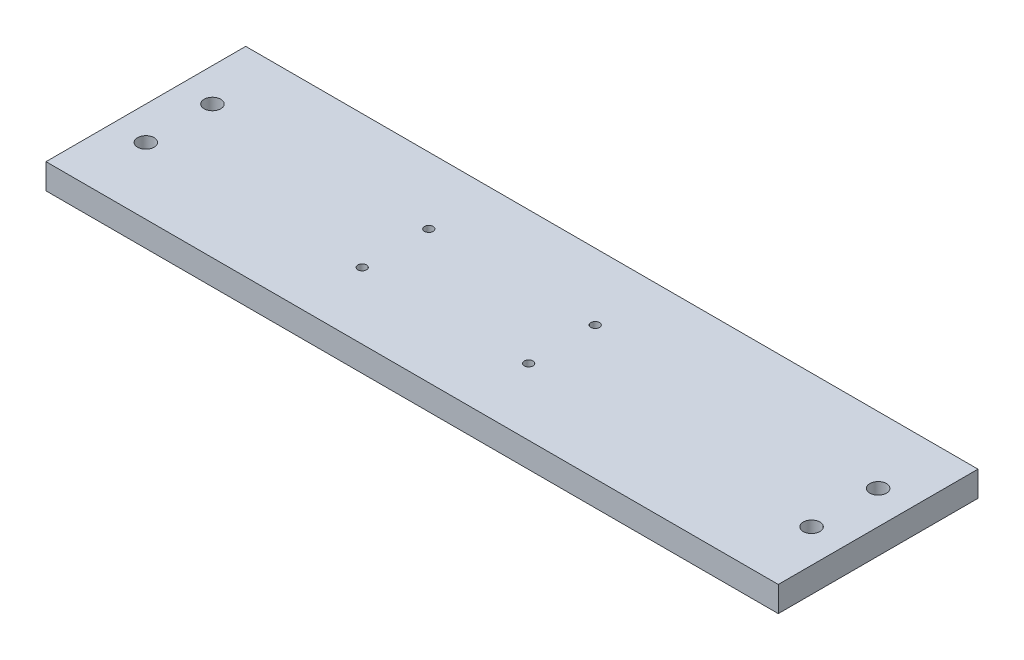
ISO-10303-21;
HEADER;
FILE_DESCRIPTION(('STEP AP214'),'2;1');
FILE_NAME('part.step','',(''),(''),'','','');
FILE_SCHEMA(('AUTOMOTIVE_DESIGN { 1 0 10303 214 1 1 1 1 }'));
ENDSEC;
DATA;
#1=APPLICATION_CONTEXT('core data for automotive mechanical design processes');
#2=APPLICATION_PROTOCOL_DEFINITION('international standard','automotive_design',2000,#1);
#3=PRODUCT_CONTEXT('',#1,'mechanical');
#4=PRODUCT('Part','Part','',(#3));
#5=PRODUCT_RELATED_PRODUCT_CATEGORY('part','',(#4));
#6=PRODUCT_DEFINITION_FORMATION('','',#4);
#7=PRODUCT_DEFINITION_CONTEXT('part definition',#1,'design');
#8=PRODUCT_DEFINITION('design','',#6,#7);
#9=PRODUCT_DEFINITION_SHAPE('','',#8);
#10=(LENGTH_UNIT() NAMED_UNIT(*) SI_UNIT(.MILLI.,.METRE.));
#11=(NAMED_UNIT(*) PLANE_ANGLE_UNIT() SI_UNIT($,.RADIAN.));
#12=(NAMED_UNIT(*) SI_UNIT($,.STERADIAN.) SOLID_ANGLE_UNIT());
#13=UNCERTAINTY_MEASURE_WITH_UNIT(LENGTH_MEASURE(1.E-05),#10,'distance_accuracy_value','');
#14=(GEOMETRIC_REPRESENTATION_CONTEXT(3) GLOBAL_UNCERTAINTY_ASSIGNED_CONTEXT((#13)) GLOBAL_UNIT_ASSIGNED_CONTEXT((#10,
#11,#12)) REPRESENTATION_CONTEXT('',''));
#15=CARTESIAN_POINT('',(0.,0.,0.));
#16=DIRECTION('',(0.,0.,1.));
#17=DIRECTION('',(1.,0.,0.));
#18=AXIS2_PLACEMENT_3D('',#15,#16,#17);
#19=CARTESIAN_POINT('',(139.7,9.652,-38.1));
#20=DIRECTION('',(-1.,0.,0.));
#21=DIRECTION('',(0.,0.,1.));
#22=AXIS2_PLACEMENT_3D('',#19,#20,#21);
#23=PLANE('',#22);
#24=DIRECTION('',(0.,0.,-1.));
#25=VECTOR('',#24,1.);
#26=CARTESIAN_POINT('',(139.7,0.,-38.1));
#27=LINE('',#26,#25);
#28=CARTESIAN_POINT('',(139.7,0.,38.1));
#29=VERTEX_POINT('',#28);
#30=CARTESIAN_POINT('',(139.7,0.,-38.1));
#31=VERTEX_POINT('',#30);
#32=EDGE_CURVE('E113',#29,#31,#27,.T.);
#33=ORIENTED_EDGE('',*,*,#32,.T.);
#34=DIRECTION('',(0.,-1.,0.));
#35=VECTOR('',#34,1.);
#36=CARTESIAN_POINT('',(139.7,9.652,-38.1));
#37=LINE('',#36,#35);
#38=CARTESIAN_POINT('',(139.7,9.652,-38.1));
#39=VERTEX_POINT('',#38);
#40=EDGE_CURVE('E11',#39,#31,#37,.T.);
#41=ORIENTED_EDGE('',*,*,#40,.F.);
#42=DIRECTION('',(0.,0.,-1.));
#43=VECTOR('',#42,1.);
#44=CARTESIAN_POINT('',(139.7,9.652,-38.1));
#45=LINE('',#44,#43);
#46=CARTESIAN_POINT('',(139.7,9.652,38.1));
#47=VERTEX_POINT('',#46);
#48=EDGE_CURVE('E97',#47,#39,#45,.T.);
#49=ORIENTED_EDGE('',*,*,#48,.F.);
#50=DIRECTION('',(0.,-1.,0.));
#51=VECTOR('',#50,1.);
#52=CARTESIAN_POINT('',(139.7,9.652,38.1));
#53=LINE('',#52,#51);
#54=EDGE_CURVE('E109',#47,#29,#53,.T.);
#55=ORIENTED_EDGE('',*,*,#54,.T.);
#56=EDGE_LOOP('',(#33,#41,#49,#55));
#57=FACE_BOUND('',#56,.T.);
#58=ADVANCED_FACE('F45',(#57),#23,.F.);
#59=CARTESIAN_POINT('',(-139.7,9.652,-38.1));
#60=DIRECTION('',(0.,0.,1.));
#61=DIRECTION('',(1.,0.,0.));
#62=AXIS2_PLACEMENT_3D('',#59,#60,#61);
#63=PLANE('',#62);
#64=DIRECTION('',(-1.,0.,0.));
#65=VECTOR('',#64,1.);
#66=CARTESIAN_POINT('',(-139.7,0.,-38.1));
#67=LINE('',#66,#65);
#68=CARTESIAN_POINT('',(-139.7,0.,-38.1));
#69=VERTEX_POINT('',#68);
#70=EDGE_CURVE('E102',#31,#69,#67,.T.);
#71=ORIENTED_EDGE('',*,*,#70,.T.);
#72=DIRECTION('',(0.,-1.,0.));
#73=VECTOR('',#72,1.);
#74=CARTESIAN_POINT('',(-139.7,9.652,-38.1));
#75=LINE('',#74,#73);
#76=CARTESIAN_POINT('',(-139.7,9.652,-38.1));
#77=VERTEX_POINT('',#76);
#78=EDGE_CURVE('E54',#77,#69,#75,.T.);
#79=ORIENTED_EDGE('',*,*,#78,.F.);
#80=DIRECTION('',(-1.,0.,0.));
#81=VECTOR('',#80,1.);
#82=CARTESIAN_POINT('',(-139.7,9.652,-38.1));
#83=LINE('',#82,#81);
#84=EDGE_CURVE('E92',#39,#77,#83,.T.);
#85=ORIENTED_EDGE('',*,*,#84,.F.);
#86=ORIENTED_EDGE('',*,*,#40,.T.);
#87=EDGE_LOOP('',(#71,#79,#85,#86));
#88=FACE_BOUND('',#87,.T.);
#89=ADVANCED_FACE('F101',(#88),#63,.F.);
#90=CARTESIAN_POINT('',(-139.7,9.652,-38.1));
#91=DIRECTION('',(1.,0.,0.));
#92=DIRECTION('',(0.,0.,-1.));
#93=AXIS2_PLACEMENT_3D('',#90,#91,#92);
#94=PLANE('',#93);
#95=DIRECTION('',(0.,0.,1.));
#96=VECTOR('',#95,1.);
#97=CARTESIAN_POINT('',(-139.7,0.,-38.1));
#98=LINE('',#97,#96);
#99=CARTESIAN_POINT('',(-139.7,0.,38.1));
#100=VERTEX_POINT('',#99);
#101=EDGE_CURVE('E79',#69,#100,#98,.T.);
#102=ORIENTED_EDGE('',*,*,#101,.T.);
#103=DIRECTION('',(0.,-1.,0.));
#104=VECTOR('',#103,1.);
#105=CARTESIAN_POINT('',(-139.7,9.652,38.1));
#106=LINE('',#105,#104);
#107=CARTESIAN_POINT('',(-139.7,9.652,38.1));
#108=VERTEX_POINT('',#107);
#109=EDGE_CURVE('E104',#108,#100,#106,.T.);
#110=ORIENTED_EDGE('',*,*,#109,.F.);
#111=DIRECTION('',(0.,0.,1.));
#112=VECTOR('',#111,1.);
#113=CARTESIAN_POINT('',(-139.7,9.652,-38.1));
#114=LINE('',#113,#112);
#115=EDGE_CURVE('E95',#77,#108,#114,.T.);
#116=ORIENTED_EDGE('',*,*,#115,.F.);
#117=ORIENTED_EDGE('',*,*,#78,.T.);
#118=EDGE_LOOP('',(#102,#110,#116,#117));
#119=FACE_BOUND('',#118,.T.);
#120=ADVANCED_FACE('F105',(#119),#94,.F.);
#121=CARTESIAN_POINT('',(-139.7,9.652,38.1));
#122=DIRECTION('',(0.,0.,-1.));
#123=DIRECTION('',(-1.,0.,0.));
#124=AXIS2_PLACEMENT_3D('',#121,#122,#123);
#125=PLANE('',#124);
#126=DIRECTION('',(1.,0.,0.));
#127=VECTOR('',#126,1.);
#128=CARTESIAN_POINT('',(-139.7,0.,38.1));
#129=LINE('',#128,#127);
#130=EDGE_CURVE('E85',#100,#29,#129,.T.);
#131=ORIENTED_EDGE('',*,*,#130,.T.);
#132=ORIENTED_EDGE('',*,*,#54,.F.);
#133=DIRECTION('',(1.,0.,0.));
#134=VECTOR('',#133,1.);
#135=CARTESIAN_POINT('',(-139.7,9.652,38.1));
#136=LINE('',#135,#134);
#137=EDGE_CURVE('E62',#108,#47,#136,.T.);
#138=ORIENTED_EDGE('',*,*,#137,.F.);
#139=ORIENTED_EDGE('',*,*,#109,.T.);
#140=EDGE_LOOP('',(#131,#132,#138,#139));
#141=FACE_BOUND('',#140,.T.);
#142=ADVANCED_FACE('F127',(#141),#125,.F.);
#143=CARTESIAN_POINT('',(0.,9.652,0.));
#144=DIRECTION('',(0.,1.,0.));
#145=DIRECTION('',(0.,0.,1.));
#146=AXIS2_PLACEMENT_3D('',#143,#144,#145);
#147=PLANE('',#146);
#148=CARTESIAN_POINT('',(-44.4500000000001,9.652,-12.7));
#149=DIRECTION('',(0.,1.,0.));
#150=DIRECTION('',(0.,0.,1.));
#151=AXIS2_PLACEMENT_3D('',#148,#149,#150);
#152=CIRCLE('',#151,1.651);
#153=CARTESIAN_POINT('',(-44.4500000000001,9.652,-11.049));
#154=VERTEX_POINT('',#153);
#155=EDGE_CURVE('E138',#154,#154,#152,.T.);
#156=ORIENTED_EDGE('',*,*,#155,.F.);
#157=EDGE_LOOP('',(#156));
#158=FACE_BOUND('',#157,.T.);
#159=CARTESIAN_POINT('',(19.0499999999999,9.652,-12.7));
#160=DIRECTION('',(0.,1.,0.));
#161=DIRECTION('',(0.,0.,1.));
#162=AXIS2_PLACEMENT_3D('',#159,#160,#161);
#163=CIRCLE('',#162,1.651);
#164=CARTESIAN_POINT('',(19.0499999999999,9.652,-11.049));
#165=VERTEX_POINT('',#164);
#166=EDGE_CURVE('E163',#165,#165,#163,.T.);
#167=ORIENTED_EDGE('',*,*,#166,.F.);
#168=EDGE_LOOP('',(#167));
#169=FACE_BOUND('',#168,.T.);
#170=CARTESIAN_POINT('',(127.,9.652,-12.7));
#171=DIRECTION('',(0.,1.,0.));
#172=DIRECTION('',(0.,0.,1.));
#173=AXIS2_PLACEMENT_3D('',#170,#171,#172);
#174=CIRCLE('',#173,3.175);
#175=CARTESIAN_POINT('',(127.,9.652,-9.525));
#176=VERTEX_POINT('',#175);
#177=EDGE_CURVE('E155',#176,#176,#174,.T.);
#178=ORIENTED_EDGE('',*,*,#177,.F.);
#179=EDGE_LOOP('',(#178));
#180=FACE_BOUND('',#179,.T.);
#181=CARTESIAN_POINT('',(127.,9.652,12.7));
#182=DIRECTION('',(0.,1.,0.));
#183=DIRECTION('',(0.,0.,-1.));
#184=AXIS2_PLACEMENT_3D('',#181,#182,#183);
#185=CIRCLE('',#184,3.175);
#186=CARTESIAN_POINT('',(127.,9.652,9.525));
#187=VERTEX_POINT('',#186);
#188=EDGE_CURVE('E146',#187,#187,#185,.T.);
#189=ORIENTED_EDGE('',*,*,#188,.F.);
#190=EDGE_LOOP('',(#189));
#191=FACE_BOUND('',#190,.T.);
#192=CARTESIAN_POINT('',(19.0499999999999,9.652,12.7));
#193=DIRECTION('',(0.,1.,0.));
#194=DIRECTION('',(0.,0.,-1.));
#195=AXIS2_PLACEMENT_3D('',#192,#193,#194);
#196=CIRCLE('',#195,1.651);
#197=CARTESIAN_POINT('',(19.0499999999999,9.652,11.049));
#198=VERTEX_POINT('',#197);
#199=EDGE_CURVE('E147',#198,#198,#196,.T.);
#200=ORIENTED_EDGE('',*,*,#199,.F.);
#201=EDGE_LOOP('',(#200));
#202=FACE_BOUND('',#201,.T.);
#203=CARTESIAN_POINT('',(-44.4500000000001,9.652,12.7));
#204=DIRECTION('',(0.,1.,0.));
#205=DIRECTION('',(0.,0.,-1.));
#206=AXIS2_PLACEMENT_3D('',#203,#204,#205);
#207=CIRCLE('',#206,1.651);
#208=CARTESIAN_POINT('',(-44.4500000000001,9.652,11.049));
#209=VERTEX_POINT('',#208);
#210=EDGE_CURVE('E186',#209,#209,#207,.T.);
#211=ORIENTED_EDGE('',*,*,#210,.F.);
#212=EDGE_LOOP('',(#211));
#213=FACE_BOUND('',#212,.T.);
#214=CARTESIAN_POINT('',(-127.,9.652,12.7));
#215=DIRECTION('',(0.,1.,0.));
#216=DIRECTION('',(0.,0.,-1.));
#217=AXIS2_PLACEMENT_3D('',#214,#215,#216);
#218=CIRCLE('',#217,3.175);
#219=CARTESIAN_POINT('',(-127.,9.652,9.525));
#220=VERTEX_POINT('',#219);
#221=EDGE_CURVE('E178',#220,#220,#218,.T.);
#222=ORIENTED_EDGE('',*,*,#221,.F.);
#223=EDGE_LOOP('',(#222));
#224=FACE_BOUND('',#223,.T.);
#225=CARTESIAN_POINT('',(-127.,9.652,-12.7));
#226=DIRECTION('',(0.,1.,0.));
#227=DIRECTION('',(0.,0.,1.));
#228=AXIS2_PLACEMENT_3D('',#225,#226,#227);
#229=CIRCLE('',#228,3.175);
#230=CARTESIAN_POINT('',(-127.,9.652,-9.525));
#231=VERTEX_POINT('',#230);
#232=EDGE_CURVE('E134',#231,#231,#229,.T.);
#233=ORIENTED_EDGE('',*,*,#232,.F.);
#234=EDGE_LOOP('',(#233));
#235=FACE_BOUND('',#234,.T.);
#236=ORIENTED_EDGE('',*,*,#48,.T.);
#237=ORIENTED_EDGE('',*,*,#84,.T.);
#238=ORIENTED_EDGE('',*,*,#115,.T.);
#239=ORIENTED_EDGE('',*,*,#137,.T.);
#240=EDGE_LOOP('',(#236,#237,#238,#239));
#241=FACE_BOUND('',#240,.T.);
#242=ADVANCED_FACE('F93',(#158,#169,#180,#191,#202,#213,#224,#235,#241),#147,.T.);
#243=CARTESIAN_POINT('',(0.,0.,0.));
#244=DIRECTION('',(0.,1.,0.));
#245=DIRECTION('',(0.,0.,1.));
#246=AXIS2_PLACEMENT_3D('',#243,#244,#245);
#247=PLANE('',#246);
#248=CARTESIAN_POINT('',(-44.4500000000001,0.,-12.7));
#249=DIRECTION('',(0.,1.,0.));
#250=DIRECTION('',(0.,0.,1.));
#251=AXIS2_PLACEMENT_3D('',#248,#249,#250);
#252=CIRCLE('',#251,1.651);
#253=CARTESIAN_POINT('',(-44.4500000000001,0.,-11.049));
#254=VERTEX_POINT('',#253);
#255=EDGE_CURVE('E167',#254,#254,#252,.T.);
#256=ORIENTED_EDGE('',*,*,#255,.T.);
#257=EDGE_LOOP('',(#256));
#258=FACE_BOUND('',#257,.T.);
#259=CARTESIAN_POINT('',(19.0499999999999,0.,-12.7));
#260=DIRECTION('',(0.,1.,0.));
#261=DIRECTION('',(0.,0.,1.));
#262=AXIS2_PLACEMENT_3D('',#259,#260,#261);
#263=CIRCLE('',#262,1.651);
#264=CARTESIAN_POINT('',(19.0499999999999,0.,-11.049));
#265=VERTEX_POINT('',#264);
#266=EDGE_CURVE('E159',#265,#265,#263,.T.);
#267=ORIENTED_EDGE('',*,*,#266,.T.);
#268=EDGE_LOOP('',(#267));
#269=FACE_BOUND('',#268,.T.);
#270=CARTESIAN_POINT('',(127.,0.,-12.7));
#271=DIRECTION('',(0.,1.,0.));
#272=DIRECTION('',(0.,0.,1.));
#273=AXIS2_PLACEMENT_3D('',#270,#271,#272);
#274=CIRCLE('',#273,3.175);
#275=CARTESIAN_POINT('',(127.,0.,-9.525));
#276=VERTEX_POINT('',#275);
#277=EDGE_CURVE('E151',#276,#276,#274,.T.);
#278=ORIENTED_EDGE('',*,*,#277,.T.);
#279=EDGE_LOOP('',(#278));
#280=FACE_BOUND('',#279,.T.);
#281=CARTESIAN_POINT('',(127.,0.,12.7));
#282=DIRECTION('',(0.,1.,0.));
#283=DIRECTION('',(0.,0.,-1.));
#284=AXIS2_PLACEMENT_3D('',#281,#282,#283);
#285=CIRCLE('',#284,3.175);
#286=CARTESIAN_POINT('',(127.,0.,9.525));
#287=VERTEX_POINT('',#286);
#288=EDGE_CURVE('E142',#287,#287,#285,.T.);
#289=ORIENTED_EDGE('',*,*,#288,.T.);
#290=EDGE_LOOP('',(#289));
#291=FACE_BOUND('',#290,.T.);
#292=CARTESIAN_POINT('',(19.0499999999999,0.,12.7));
#293=DIRECTION('',(0.,1.,0.));
#294=DIRECTION('',(0.,0.,-1.));
#295=AXIS2_PLACEMENT_3D('',#292,#293,#294);
#296=CIRCLE('',#295,1.651);
#297=CARTESIAN_POINT('',(19.0499999999999,0.,11.049));
#298=VERTEX_POINT('',#297);
#299=EDGE_CURVE('E190',#298,#298,#296,.T.);
#300=ORIENTED_EDGE('',*,*,#299,.T.);
#301=EDGE_LOOP('',(#300));
#302=FACE_BOUND('',#301,.T.);
#303=CARTESIAN_POINT('',(-44.4500000000001,0.,12.7));
#304=DIRECTION('',(0.,1.,0.));
#305=DIRECTION('',(0.,0.,-1.));
#306=AXIS2_PLACEMENT_3D('',#303,#304,#305);
#307=CIRCLE('',#306,1.651);
#308=CARTESIAN_POINT('',(-44.4500000000001,0.,11.049));
#309=VERTEX_POINT('',#308);
#310=EDGE_CURVE('E182',#309,#309,#307,.T.);
#311=ORIENTED_EDGE('',*,*,#310,.T.);
#312=EDGE_LOOP('',(#311));
#313=FACE_BOUND('',#312,.T.);
#314=CARTESIAN_POINT('',(-127.,0.,12.7));
#315=DIRECTION('',(0.,1.,0.));
#316=DIRECTION('',(0.,0.,-1.));
#317=AXIS2_PLACEMENT_3D('',#314,#315,#316);
#318=CIRCLE('',#317,3.175);
#319=CARTESIAN_POINT('',(-127.,0.,9.525));
#320=VERTEX_POINT('',#319);
#321=EDGE_CURVE('E174',#320,#320,#318,.T.);
#322=ORIENTED_EDGE('',*,*,#321,.T.);
#323=EDGE_LOOP('',(#322));
#324=FACE_BOUND('',#323,.T.);
#325=CARTESIAN_POINT('',(-127.,0.,-12.7));
#326=DIRECTION('',(0.,1.,0.));
#327=DIRECTION('',(0.,0.,1.));
#328=AXIS2_PLACEMENT_3D('',#325,#326,#327);
#329=CIRCLE('',#328,3.175);
#330=CARTESIAN_POINT('',(-127.,0.,-9.525));
#331=VERTEX_POINT('',#330);
#332=EDGE_CURVE('E117',#331,#331,#329,.T.);
#333=ORIENTED_EDGE('',*,*,#332,.T.);
#334=EDGE_LOOP('',(#333));
#335=FACE_BOUND('',#334,.T.);
#336=ORIENTED_EDGE('',*,*,#32,.F.);
#337=ORIENTED_EDGE('',*,*,#130,.F.);
#338=ORIENTED_EDGE('',*,*,#101,.F.);
#339=ORIENTED_EDGE('',*,*,#70,.F.);
#340=EDGE_LOOP('',(#336,#337,#338,#339));
#341=FACE_BOUND('',#340,.T.);
#342=ADVANCED_FACE('F130',(#258,#269,#280,#291,#302,#313,#324,#335,#341),#247,.F.);
#343=CARTESIAN_POINT('',(-127.,0.,-12.7));
#344=DIRECTION('',(0.,1.,0.));
#345=DIRECTION('',(0.,0.,1.));
#346=AXIS2_PLACEMENT_3D('',#343,#344,#345);
#347=CYLINDRICAL_SURFACE('',#346,3.175);
#348=ORIENTED_EDGE('',*,*,#332,.F.);
#349=EDGE_LOOP('',(#348));
#350=FACE_BOUND('',#349,.T.);
#351=ORIENTED_EDGE('',*,*,#232,.T.);
#352=EDGE_LOOP('',(#351));
#353=FACE_BOUND('',#352,.T.);
#354=ADVANCED_FACE('F210',(#350,#353),#347,.F.);
#355=CARTESIAN_POINT('',(-127.,0.,12.7));
#356=DIRECTION('',(0.,1.,0.));
#357=DIRECTION('',(0.,0.,1.));
#358=AXIS2_PLACEMENT_3D('',#355,#356,#357);
#359=CYLINDRICAL_SURFACE('',#358,3.175);
#360=ORIENTED_EDGE('',*,*,#321,.F.);
#361=EDGE_LOOP('',(#360));
#362=FACE_BOUND('',#361,.T.);
#363=ORIENTED_EDGE('',*,*,#221,.T.);
#364=EDGE_LOOP('',(#363));
#365=FACE_BOUND('',#364,.T.);
#366=ADVANCED_FACE('F212',(#362,#365),#359,.F.);
#367=CARTESIAN_POINT('',(-44.4500000000001,0.,12.7));
#368=DIRECTION('',(0.,1.,0.));
#369=DIRECTION('',(0.,0.,1.));
#370=AXIS2_PLACEMENT_3D('',#367,#368,#369);
#371=CYLINDRICAL_SURFACE('',#370,1.651);
#372=ORIENTED_EDGE('',*,*,#310,.F.);
#373=EDGE_LOOP('',(#372));
#374=FACE_BOUND('',#373,.T.);
#375=ORIENTED_EDGE('',*,*,#210,.T.);
#376=EDGE_LOOP('',(#375));
#377=FACE_BOUND('',#376,.T.);
#378=ADVANCED_FACE('F219',(#374,#377),#371,.F.);
#379=CARTESIAN_POINT('',(19.0499999999999,0.,12.7));
#380=DIRECTION('',(0.,1.,0.));
#381=DIRECTION('',(0.,0.,1.));
#382=AXIS2_PLACEMENT_3D('',#379,#380,#381);
#383=CYLINDRICAL_SURFACE('',#382,1.651);
#384=ORIENTED_EDGE('',*,*,#299,.F.);
#385=EDGE_LOOP('',(#384));
#386=FACE_BOUND('',#385,.T.);
#387=ORIENTED_EDGE('',*,*,#199,.T.);
#388=EDGE_LOOP('',(#387));
#389=FACE_BOUND('',#388,.T.);
#390=ADVANCED_FACE('F198',(#386,#389),#383,.F.);
#391=CARTESIAN_POINT('',(127.,0.,12.7));
#392=DIRECTION('',(0.,1.,0.));
#393=DIRECTION('',(0.,0.,1.));
#394=AXIS2_PLACEMENT_3D('',#391,#392,#393);
#395=CYLINDRICAL_SURFACE('',#394,3.175);
#396=ORIENTED_EDGE('',*,*,#288,.F.);
#397=EDGE_LOOP('',(#396));
#398=FACE_BOUND('',#397,.T.);
#399=ORIENTED_EDGE('',*,*,#188,.T.);
#400=EDGE_LOOP('',(#399));
#401=FACE_BOUND('',#400,.T.);
#402=ADVANCED_FACE('F279',(#398,#401),#395,.F.);
#403=CARTESIAN_POINT('',(127.,0.,-12.7));
#404=DIRECTION('',(0.,1.,0.));
#405=DIRECTION('',(0.,0.,1.));
#406=AXIS2_PLACEMENT_3D('',#403,#404,#405);
#407=CYLINDRICAL_SURFACE('',#406,3.175);
#408=ORIENTED_EDGE('',*,*,#277,.F.);
#409=EDGE_LOOP('',(#408));
#410=FACE_BOUND('',#409,.T.);
#411=ORIENTED_EDGE('',*,*,#177,.T.);
#412=EDGE_LOOP('',(#411));
#413=FACE_BOUND('',#412,.T.);
#414=ADVANCED_FACE('F289',(#410,#413),#407,.F.);
#415=CARTESIAN_POINT('',(19.0499999999999,0.,-12.7));
#416=DIRECTION('',(0.,1.,0.));
#417=DIRECTION('',(0.,0.,1.));
#418=AXIS2_PLACEMENT_3D('',#415,#416,#417);
#419=CYLINDRICAL_SURFACE('',#418,1.651);
#420=ORIENTED_EDGE('',*,*,#266,.F.);
#421=EDGE_LOOP('',(#420));
#422=FACE_BOUND('',#421,.T.);
#423=ORIENTED_EDGE('',*,*,#166,.T.);
#424=EDGE_LOOP('',(#423));
#425=FACE_BOUND('',#424,.T.);
#426=ADVANCED_FACE('F298',(#422,#425),#419,.F.);
#427=CARTESIAN_POINT('',(-44.4500000000001,0.,-12.7));
#428=DIRECTION('',(0.,1.,0.));
#429=DIRECTION('',(0.,0.,1.));
#430=AXIS2_PLACEMENT_3D('',#427,#428,#429);
#431=CYLINDRICAL_SURFACE('',#430,1.651);
#432=ORIENTED_EDGE('',*,*,#255,.F.);
#433=EDGE_LOOP('',(#432));
#434=FACE_BOUND('',#433,.T.);
#435=ORIENTED_EDGE('',*,*,#155,.T.);
#436=EDGE_LOOP('',(#435));
#437=FACE_BOUND('',#436,.T.);
#438=ADVANCED_FACE('F308',(#434,#437),#431,.F.);
#439=CLOSED_SHELL('',(#58,#89,#120,#142,#242,#342,#354,#366,#378,#390,#402,#414,#426,#438));
#440=MANIFOLD_SOLID_BREP('B2',#439);
#441=ADVANCED_BREP_SHAPE_REPRESENTATION('',(#18,#440),#14);
#442=SHAPE_DEFINITION_REPRESENTATION(#9,#441);
ENDSEC;
END-ISO-10303-21;
